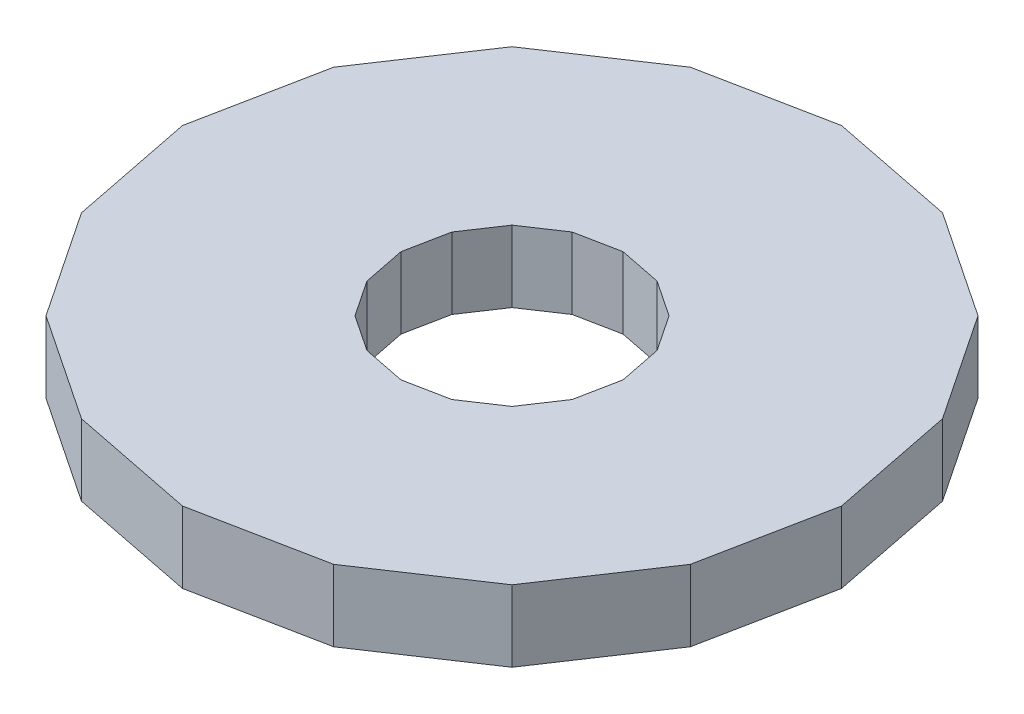
ISO-10303-21;
HEADER;
FILE_DESCRIPTION(('STEP AP214'),'2;1');
FILE_NAME('part.step','',(''),(''),'','','');
FILE_SCHEMA(('AUTOMOTIVE_DESIGN { 1 0 10303 214 1 1 1 1 }'));
ENDSEC;
DATA;
#1=APPLICATION_CONTEXT('core data for automotive mechanical design processes');
#2=APPLICATION_PROTOCOL_DEFINITION('international standard','automotive_design',2000,#1);
#3=PRODUCT_CONTEXT('',#1,'mechanical');
#4=PRODUCT('Part','Part','',(#3));
#5=PRODUCT_RELATED_PRODUCT_CATEGORY('part','',(#4));
#6=PRODUCT_DEFINITION_FORMATION('','',#4);
#7=PRODUCT_DEFINITION_CONTEXT('part definition',#1,'design');
#8=PRODUCT_DEFINITION('design','',#6,#7);
#9=PRODUCT_DEFINITION_SHAPE('','',#8);
#10=(LENGTH_UNIT() NAMED_UNIT(*) SI_UNIT(.MILLI.,.METRE.));
#11=(NAMED_UNIT(*) PLANE_ANGLE_UNIT() SI_UNIT($,.RADIAN.));
#12=(NAMED_UNIT(*) SI_UNIT($,.STERADIAN.) SOLID_ANGLE_UNIT());
#13=UNCERTAINTY_MEASURE_WITH_UNIT(LENGTH_MEASURE(1.E-05),#10,'distance_accuracy_value','');
#14=(GEOMETRIC_REPRESENTATION_CONTEXT(3) GLOBAL_UNCERTAINTY_ASSIGNED_CONTEXT((#13)) GLOBAL_UNIT_ASSIGNED_CONTEXT((#10,
#11,#12)) REPRESENTATION_CONTEXT('',''));
#15=CARTESIAN_POINT('',(0.,0.,0.));
#16=DIRECTION('',(0.,0.,1.));
#17=DIRECTION('',(1.,0.,0.));
#18=AXIS2_PLACEMENT_3D('',#15,#16,#17);
#19=CARTESIAN_POINT('',(0.,19.05,0.));
#20=DIRECTION('',(0.,1.,0.));
#21=DIRECTION('',(0.,0.,1.));
#22=AXIS2_PLACEMENT_3D('',#19,#20,#21);
#23=PLANE('',#22);
#24=DIRECTION('',(0.195090322016118,0.,-0.980785280403233));
#25=VECTOR('',#24,1.);
#26=CARTESIAN_POINT('',(81.1927235611236,19.05,33.6311272650259));
#27=LINE('',#26,#25);
#28=CARTESIAN_POINT('',(81.1927235611236,19.05,33.6311272650259));
#29=VERTEX_POINT('',#28);
#30=CARTESIAN_POINT('',(87.8823707030563,19.05,-9.88793482076298E-13));
#31=VERTEX_POINT('',#30);
#32=EDGE_CURVE('E377',#29,#31,#27,.T.);
#33=ORIENTED_EDGE('',*,*,#32,.T.);
#34=DIRECTION('',(-0.19509032201614,0.,-0.980785280403228));
#35=VECTOR('',#34,1.);
#36=CARTESIAN_POINT('',(87.8823707030563,19.05,-9.88793482076298E-13));
#37=LINE('',#36,#35);
#38=CARTESIAN_POINT('',(81.1927235611229,19.05,-33.6311272650277));
#39=VERTEX_POINT('',#38);
#40=EDGE_CURVE('E381',#31,#39,#37,.T.);
#41=ORIENTED_EDGE('',*,*,#40,.T.);
#42=DIRECTION('',(-0.555570233019611,0.,-0.831469612302539));
#43=VECTOR('',#42,1.);
#44=CARTESIAN_POINT('',(81.1927235611229,19.05,-33.6311272650277));
#45=LINE('',#44,#43);
#46=CARTESIAN_POINT('',(62.1422202708804,19.05,-62.1422202708818));
#47=VERTEX_POINT('',#46);
#48=EDGE_CURVE('E385',#39,#47,#45,.T.);
#49=ORIENTED_EDGE('',*,*,#48,.T.);
#50=DIRECTION('',(-0.831469612302551,0.,-0.555570233019593));
#51=VECTOR('',#50,1.);
#52=CARTESIAN_POINT('',(62.1422202708804,19.05,-62.1422202708818));
#53=LINE('',#52,#51);
#54=CARTESIAN_POINT('',(33.6311272650259,19.05,-81.1927235611237));
#55=VERTEX_POINT('',#54);
#56=EDGE_CURVE('E387',#47,#55,#53,.T.);
#57=ORIENTED_EDGE('',*,*,#56,.T.);
#58=DIRECTION('',(-0.980785280403233,0.,-0.195090322016117));
#59=VECTOR('',#58,1.);
#60=CARTESIAN_POINT('',(33.6311272650259,19.05,-81.1927235611237));
#61=LINE('',#60,#59);
#62=CARTESIAN_POINT('',(-9.85389338037336E-13,19.05,-87.8823707030564));
#63=VERTEX_POINT('',#62);
#64=EDGE_CURVE('E389',#55,#63,#61,.T.);
#65=ORIENTED_EDGE('',*,*,#64,.T.);
#66=DIRECTION('',(-0.980785280403228,0.,0.195090322016139));
#67=VECTOR('',#66,1.);
#68=CARTESIAN_POINT('',(-9.85389338037336E-13,19.05,-87.8823707030564));
#69=LINE('',#68,#67);
#70=CARTESIAN_POINT('',(-33.6311272650277,19.05,-81.1927235611229));
#71=VERTEX_POINT('',#70);
#72=EDGE_CURVE('E391',#63,#71,#69,.T.);
#73=ORIENTED_EDGE('',*,*,#72,.T.);
#74=DIRECTION('',(-0.831469612302539,0.,0.555570233019612));
#75=VECTOR('',#74,1.);
#76=CARTESIAN_POINT('',(-33.6311272650277,19.05,-81.1927235611229));
#77=LINE('',#76,#75);
#78=CARTESIAN_POINT('',(-62.1422202708818,19.05,-62.1422202708804));
#79=VERTEX_POINT('',#78);
#80=EDGE_CURVE('E393',#71,#79,#77,.T.);
#81=ORIENTED_EDGE('',*,*,#80,.T.);
#82=DIRECTION('',(-0.555570233019593,0.,0.831469612302551));
#83=VECTOR('',#82,1.);
#84=CARTESIAN_POINT('',(-62.1422202708818,19.05,-62.1422202708804));
#85=LINE('',#84,#83);
#86=CARTESIAN_POINT('',(-81.1927235611237,19.05,-33.6311272650259));
#87=VERTEX_POINT('',#86);
#88=EDGE_CURVE('E395',#79,#87,#85,.T.);
#89=ORIENTED_EDGE('',*,*,#88,.T.);
#90=DIRECTION('',(-0.195090322016117,0.,0.980785280403233));
#91=VECTOR('',#90,1.);
#92=CARTESIAN_POINT('',(-81.1927235611237,19.05,-33.6311272650259));
#93=LINE('',#92,#91);
#94=CARTESIAN_POINT('',(-87.8823707030563,19.05,9.43670599142186E-13));
#95=VERTEX_POINT('',#94);
#96=EDGE_CURVE('E397',#87,#95,#93,.T.);
#97=ORIENTED_EDGE('',*,*,#96,.T.);
#98=DIRECTION('',(0.195090322016139,0.,0.980785280403228));
#99=VECTOR('',#98,1.);
#100=CARTESIAN_POINT('',(-87.8823707030563,19.05,9.43670599142186E-13));
#101=LINE('',#100,#99);
#102=CARTESIAN_POINT('',(-81.1927235611229,19.05,33.6311272650277));
#103=VERTEX_POINT('',#102);
#104=EDGE_CURVE('E399',#95,#103,#101,.T.);
#105=ORIENTED_EDGE('',*,*,#104,.T.);
#106=DIRECTION('',(0.555570233019611,0.,0.831469612302539));
#107=VECTOR('',#106,1.);
#108=CARTESIAN_POINT('',(-81.1927235611229,19.05,33.6311272650277));
#109=LINE('',#108,#107);
#110=CARTESIAN_POINT('',(-62.1422202708804,19.05,62.1422202708818));
#111=VERTEX_POINT('',#110);
#112=EDGE_CURVE('E401',#103,#111,#109,.T.);
#113=ORIENTED_EDGE('',*,*,#112,.T.);
#114=DIRECTION('',(0.831469612302552,0.,0.555570233019593));
#115=VECTOR('',#114,1.);
#116=CARTESIAN_POINT('',(-62.1422202708804,19.05,62.1422202708818));
#117=LINE('',#116,#115);
#118=CARTESIAN_POINT('',(-33.6311272650259,19.05,81.1927235611237));
#119=VERTEX_POINT('',#118);
#120=EDGE_CURVE('E403',#111,#119,#117,.T.);
#121=ORIENTED_EDGE('',*,*,#120,.T.);
#122=DIRECTION('',(0.980785280403233,0.,0.195090322016118));
#123=VECTOR('',#122,1.);
#124=CARTESIAN_POINT('',(-33.6311272650259,19.05,81.1927235611237));
#125=LINE('',#124,#123);
#126=CARTESIAN_POINT('',(9.94113703043829E-13,19.05,87.8823707030563));
#127=VERTEX_POINT('',#126);
#128=EDGE_CURVE('E405',#119,#127,#125,.T.);
#129=ORIENTED_EDGE('',*,*,#128,.T.);
#130=DIRECTION('',(0.980785280403228,0.,-0.195090322016139));
#131=VECTOR('',#130,1.);
#132=CARTESIAN_POINT('',(9.94113703043829E-13,19.05,87.8823707030563));
#133=LINE('',#132,#131);
#134=CARTESIAN_POINT('',(33.6311272650277,19.05,81.1927235611229));
#135=VERTEX_POINT('',#134);
#136=EDGE_CURVE('E407',#127,#135,#133,.T.);
#137=ORIENTED_EDGE('',*,*,#136,.T.);
#138=DIRECTION('',(0.831469612302539,0.,-0.555570233019612));
#139=VECTOR('',#138,1.);
#140=CARTESIAN_POINT('',(33.6311272650277,19.05,81.1927235611229));
#141=LINE('',#140,#139);
#142=CARTESIAN_POINT('',(62.1422202708818,19.05,62.1422202708804));
#143=VERTEX_POINT('',#142);
#144=EDGE_CURVE('E409',#135,#143,#141,.T.);
#145=ORIENTED_EDGE('',*,*,#144,.T.);
#146=DIRECTION('',(0.555570233019593,0.,-0.831469612302551));
#147=VECTOR('',#146,1.);
#148=CARTESIAN_POINT('',(62.1422202708818,19.05,62.1422202708804));
#149=LINE('',#148,#147);
#150=EDGE_CURVE('E411',#143,#29,#149,.T.);
#151=ORIENTED_EDGE('',*,*,#150,.T.);
#152=EDGE_LOOP('',(#33,#41,#49,#57,#65,#73,#81,#89,#97,#105,#113,#121,#129,#137,#145,#151));
#153=FACE_BOUND('',#152,.T.);
#154=DIRECTION('',(-0.195090322016139,0.,-0.980785280403228));
#155=VECTOR('',#154,1.);
#156=CARTESIAN_POINT('',(29.6127360114509,19.05,-3.31302602909172E-13));
#157=LINE('',#156,#155);
#158=CARTESIAN_POINT('',(29.6127360114509,19.05,-3.31302602909172E-13));
#159=VERTEX_POINT('',#158);
#160=CARTESIAN_POINT('',(27.3586007026393,19.05,-11.3323034585836));
#161=VERTEX_POINT('',#160);
#162=EDGE_CURVE('E253',#159,#161,#157,.T.);
#163=ORIENTED_EDGE('',*,*,#162,.F.);
#164=DIRECTION('',(0.195090322016117,0.,-0.980785280403233));
#165=VECTOR('',#164,1.);
#166=CARTESIAN_POINT('',(27.3586007026396,19.05,11.332303458583));
#167=LINE('',#166,#165);
#168=CARTESIAN_POINT('',(27.3586007026396,19.05,11.332303458583));
#169=VERTEX_POINT('',#168);
#170=EDGE_CURVE('E244',#169,#159,#167,.T.);
#171=ORIENTED_EDGE('',*,*,#170,.F.);
#172=DIRECTION('',(0.555570233019593,0.,-0.831469612302551));
#173=VECTOR('',#172,1.);
#174=CARTESIAN_POINT('',(20.9393664431843,19.05,20.9393664431838));
#175=LINE('',#174,#173);
#176=CARTESIAN_POINT('',(20.9393664431843,19.05,20.9393664431838));
#177=VERTEX_POINT('',#176);
#178=EDGE_CURVE('E299',#177,#169,#175,.T.);
#179=ORIENTED_EDGE('',*,*,#178,.F.);
#180=DIRECTION('',(0.831469612302539,0.,-0.555570233019612));
#181=VECTOR('',#180,1.);
#182=CARTESIAN_POINT('',(11.3323034585837,19.05,27.3586007026393));
#183=LINE('',#182,#181);
#184=CARTESIAN_POINT('',(11.3323034585837,19.05,27.3586007026393));
#185=VERTEX_POINT('',#184);
#186=EDGE_CURVE('E296',#185,#177,#183,.T.);
#187=ORIENTED_EDGE('',*,*,#186,.F.);
#188=DIRECTION('',(0.980785280403228,0.,-0.19509032201614));
#189=VECTOR('',#188,1.);
#190=CARTESIAN_POINT('',(3.33597215897801E-13,19.05,29.6127360114509));
#191=LINE('',#190,#189);
#192=CARTESIAN_POINT('',(3.33597215897801E-13,19.05,29.6127360114509));
#193=VERTEX_POINT('',#192);
#194=EDGE_CURVE('E293',#193,#185,#191,.T.);
#195=ORIENTED_EDGE('',*,*,#194,.F.);
#196=DIRECTION('',(0.980785280403233,0.,0.195090322016117));
#197=VECTOR('',#196,1.);
#198=CARTESIAN_POINT('',(-11.332303458583,19.05,27.3586007026396));
#199=LINE('',#198,#197);
#200=CARTESIAN_POINT('',(-11.332303458583,19.05,27.3586007026396));
#201=VERTEX_POINT('',#200);
#202=EDGE_CURVE('E291',#201,#193,#199,.T.);
#203=ORIENTED_EDGE('',*,*,#202,.F.);
#204=DIRECTION('',(0.831469612302552,0.,0.555570233019593));
#205=VECTOR('',#204,1.);
#206=CARTESIAN_POINT('',(-20.9393664431838,19.05,20.9393664431843));
#207=LINE('',#206,#205);
#208=CARTESIAN_POINT('',(-20.9393664431838,19.05,20.9393664431843));
#209=VERTEX_POINT('',#208);
#210=EDGE_CURVE('E288',#209,#201,#207,.T.);
#211=ORIENTED_EDGE('',*,*,#210,.F.);
#212=DIRECTION('',(0.555570233019612,0.,0.831469612302539));
#213=VECTOR('',#212,1.);
#214=CARTESIAN_POINT('',(-27.3586007026393,19.05,11.3323034585836));
#215=LINE('',#214,#213);
#216=CARTESIAN_POINT('',(-27.3586007026393,19.05,11.3323034585836));
#217=VERTEX_POINT('',#216);
#218=EDGE_CURVE('E286',#217,#209,#215,.T.);
#219=ORIENTED_EDGE('',*,*,#218,.F.);
#220=DIRECTION('',(0.195090322016139,0.,0.980785280403228));
#221=VECTOR('',#220,1.);
#222=CARTESIAN_POINT('',(-29.6127360114509,19.05,3.48672670994903E-13));
#223=LINE('',#222,#221);
#224=CARTESIAN_POINT('',(-29.6127360114509,19.05,3.48672670994903E-13));
#225=VERTEX_POINT('',#224);
#226=EDGE_CURVE('E283',#225,#217,#223,.T.);
#227=ORIENTED_EDGE('',*,*,#226,.F.);
#228=DIRECTION('',(-0.195090322016117,0.,0.980785280403233));
#229=VECTOR('',#228,1.);
#230=CARTESIAN_POINT('',(-27.3586007026396,19.05,-11.332303458583));
#231=LINE('',#230,#229);
#232=CARTESIAN_POINT('',(-27.3586007026396,19.05,-11.332303458583));
#233=VERTEX_POINT('',#232);
#234=EDGE_CURVE('E281',#233,#225,#231,.T.);
#235=ORIENTED_EDGE('',*,*,#234,.F.);
#236=DIRECTION('',(-0.555570233019593,0.,0.831469612302551));
#237=VECTOR('',#236,1.);
#238=CARTESIAN_POINT('',(-20.9393664431843,19.05,-20.9393664431838));
#239=LINE('',#238,#237);
#240=CARTESIAN_POINT('',(-20.9393664431843,19.05,-20.9393664431838));
#241=VERTEX_POINT('',#240);
#242=EDGE_CURVE('E279',#241,#233,#239,.T.);
#243=ORIENTED_EDGE('',*,*,#242,.F.);
#244=DIRECTION('',(-0.831469612302539,0.,0.555570233019612));
#245=VECTOR('',#244,1.);
#246=CARTESIAN_POINT('',(-11.3323034585836,19.05,-27.3586007026393));
#247=LINE('',#246,#245);
#248=CARTESIAN_POINT('',(-11.3323034585836,19.05,-27.3586007026393));
#249=VERTEX_POINT('',#248);
#250=EDGE_CURVE('E277',#249,#241,#247,.T.);
#251=ORIENTED_EDGE('',*,*,#250,.F.);
#252=DIRECTION('',(-0.980785280403228,0.,0.195090322016139));
#253=VECTOR('',#252,1.);
#254=CARTESIAN_POINT('',(-3.57441096400448E-13,19.05,-29.6127360114509));
#255=LINE('',#254,#253);
#256=CARTESIAN_POINT('',(-3.57441096400448E-13,19.05,-29.6127360114509));
#257=VERTEX_POINT('',#256);
#258=EDGE_CURVE('E275',#257,#249,#255,.T.);
#259=ORIENTED_EDGE('',*,*,#258,.F.);
#260=DIRECTION('',(-0.980785280403233,0.,-0.195090322016117));
#261=VECTOR('',#260,1.);
#262=CARTESIAN_POINT('',(11.332303458583,19.05,-27.3586007026396));
#263=LINE('',#262,#261);
#264=CARTESIAN_POINT('',(11.332303458583,19.05,-27.3586007026396));
#265=VERTEX_POINT('',#264);
#266=EDGE_CURVE('E273',#265,#257,#263,.T.);
#267=ORIENTED_EDGE('',*,*,#266,.F.);
#268=DIRECTION('',(-0.831469612302552,0.,-0.555570233019593));
#269=VECTOR('',#268,1.);
#270=CARTESIAN_POINT('',(20.9393664431838,19.05,-20.9393664431843));
#271=LINE('',#270,#269);
#272=CARTESIAN_POINT('',(20.9393664431838,19.05,-20.9393664431843));
#273=VERTEX_POINT('',#272);
#274=EDGE_CURVE('E269',#273,#265,#271,.T.);
#275=ORIENTED_EDGE('',*,*,#274,.F.);
#276=DIRECTION('',(-0.555570233019612,0.,-0.831469612302539));
#277=VECTOR('',#276,1.);
#278=CARTESIAN_POINT('',(27.3586007026393,19.05,-11.3323034585836));
#279=LINE('',#278,#277);
#280=EDGE_CURVE('E267',#161,#273,#279,.T.);
#281=ORIENTED_EDGE('',*,*,#280,.F.);
#282=EDGE_LOOP('',(#163,#171,#179,#187,#195,#203,#211,#219,#227,#235,#243,#251,#259,#267,#275,#281));
#283=FACE_BOUND('',#282,.T.);
#284=ADVANCED_FACE('F35',(#153,#283),#23,.T.);
#285=CARTESIAN_POINT('',(0.,0.,0.));
#286=DIRECTION('',(0.,1.,0.));
#287=DIRECTION('',(0.,0.,1.));
#288=AXIS2_PLACEMENT_3D('',#285,#286,#287);
#289=PLANE('',#288);
#290=DIRECTION('',(0.195090322016118,0.,-0.980785280403233));
#291=VECTOR('',#290,1.);
#292=CARTESIAN_POINT('',(81.1927235611236,0.,33.6311272650259));
#293=LINE('',#292,#291);
#294=CARTESIAN_POINT('',(81.1927235611236,0.,33.6311272650259));
#295=VERTEX_POINT('',#294);
#296=CARTESIAN_POINT('',(87.8823707030563,0.,-9.88793482076298E-13));
#297=VERTEX_POINT('',#296);
#298=EDGE_CURVE('E262',#295,#297,#293,.T.);
#299=ORIENTED_EDGE('',*,*,#298,.F.);
#300=DIRECTION('',(0.555570233019593,0.,-0.831469612302551));
#301=VECTOR('',#300,1.);
#302=CARTESIAN_POINT('',(62.1422202708818,0.,62.1422202708804));
#303=LINE('',#302,#301);
#304=CARTESIAN_POINT('',(62.1422202708818,0.,62.1422202708804));
#305=VERTEX_POINT('',#304);
#306=EDGE_CURVE('E382',#305,#295,#303,.T.);
#307=ORIENTED_EDGE('',*,*,#306,.F.);
#308=DIRECTION('',(0.831469612302539,0.,-0.555570233019612));
#309=VECTOR('',#308,1.);
#310=CARTESIAN_POINT('',(33.6311272650277,0.,81.1927235611229));
#311=LINE('',#310,#309);
#312=CARTESIAN_POINT('',(33.6311272650277,0.,81.1927235611229));
#313=VERTEX_POINT('',#312);
#314=EDGE_CURVE('E443',#313,#305,#311,.T.);
#315=ORIENTED_EDGE('',*,*,#314,.F.);
#316=DIRECTION('',(0.980785280403228,0.,-0.195090322016139));
#317=VECTOR('',#316,1.);
#318=CARTESIAN_POINT('',(9.94113703043829E-13,0.,87.8823707030563));
#319=LINE('',#318,#317);
#320=CARTESIAN_POINT('',(9.94113703043829E-13,0.,87.8823707030563));
#321=VERTEX_POINT('',#320);
#322=EDGE_CURVE('E441',#321,#313,#319,.T.);
#323=ORIENTED_EDGE('',*,*,#322,.F.);
#324=DIRECTION('',(0.980785280403233,0.,0.195090322016118));
#325=VECTOR('',#324,1.);
#326=CARTESIAN_POINT('',(-33.6311272650259,0.,81.1927235611237));
#327=LINE('',#326,#325);
#328=CARTESIAN_POINT('',(-33.6311272650259,0.,81.1927235611237));
#329=VERTEX_POINT('',#328);
#330=EDGE_CURVE('E439',#329,#321,#327,.T.);
#331=ORIENTED_EDGE('',*,*,#330,.F.);
#332=DIRECTION('',(0.831469612302552,0.,0.555570233019593));
#333=VECTOR('',#332,1.);
#334=CARTESIAN_POINT('',(-62.1422202708804,0.,62.1422202708818));
#335=LINE('',#334,#333);
#336=CARTESIAN_POINT('',(-62.1422202708804,0.,62.1422202708818));
#337=VERTEX_POINT('',#336);
#338=EDGE_CURVE('E437',#337,#329,#335,.T.);
#339=ORIENTED_EDGE('',*,*,#338,.F.);
#340=DIRECTION('',(0.555570233019611,0.,0.831469612302539));
#341=VECTOR('',#340,1.);
#342=CARTESIAN_POINT('',(-81.1927235611229,0.,33.6311272650277));
#343=LINE('',#342,#341);
#344=CARTESIAN_POINT('',(-81.1927235611229,0.,33.6311272650277));
#345=VERTEX_POINT('',#344);
#346=EDGE_CURVE('E435',#345,#337,#343,.T.);
#347=ORIENTED_EDGE('',*,*,#346,.F.);
#348=DIRECTION('',(0.195090322016139,0.,0.980785280403228));
#349=VECTOR('',#348,1.);
#350=CARTESIAN_POINT('',(-87.8823707030563,0.,9.43670599142186E-13));
#351=LINE('',#350,#349);
#352=CARTESIAN_POINT('',(-87.8823707030563,0.,9.43670599142186E-13));
#353=VERTEX_POINT('',#352);
#354=EDGE_CURVE('E433',#353,#345,#351,.T.);
#355=ORIENTED_EDGE('',*,*,#354,.F.);
#356=DIRECTION('',(-0.195090322016117,0.,0.980785280403233));
#357=VECTOR('',#356,1.);
#358=CARTESIAN_POINT('',(-81.1927235611237,0.,-33.6311272650259));
#359=LINE('',#358,#357);
#360=CARTESIAN_POINT('',(-81.1927235611237,0.,-33.6311272650259));
#361=VERTEX_POINT('',#360);
#362=EDGE_CURVE('E431',#361,#353,#359,.T.);
#363=ORIENTED_EDGE('',*,*,#362,.F.);
#364=DIRECTION('',(-0.555570233019593,0.,0.831469612302551));
#365=VECTOR('',#364,1.);
#366=CARTESIAN_POINT('',(-62.1422202708818,0.,-62.1422202708804));
#367=LINE('',#366,#365);
#368=CARTESIAN_POINT('',(-62.1422202708818,0.,-62.1422202708804));
#369=VERTEX_POINT('',#368);
#370=EDGE_CURVE('E429',#369,#361,#367,.T.);
#371=ORIENTED_EDGE('',*,*,#370,.F.);
#372=DIRECTION('',(-0.831469612302539,0.,0.555570233019612));
#373=VECTOR('',#372,1.);
#374=CARTESIAN_POINT('',(-33.6311272650277,0.,-81.1927235611229));
#375=LINE('',#374,#373);
#376=CARTESIAN_POINT('',(-33.6311272650277,0.,-81.1927235611229));
#377=VERTEX_POINT('',#376);
#378=EDGE_CURVE('E427',#377,#369,#375,.T.);
#379=ORIENTED_EDGE('',*,*,#378,.F.);
#380=DIRECTION('',(-0.980785280403228,0.,0.195090322016139));
#381=VECTOR('',#380,1.);
#382=CARTESIAN_POINT('',(-9.85389338037336E-13,0.,-87.8823707030564));
#383=LINE('',#382,#381);
#384=CARTESIAN_POINT('',(-9.85389338037336E-13,0.,-87.8823707030564));
#385=VERTEX_POINT('',#384);
#386=EDGE_CURVE('E425',#385,#377,#383,.T.);
#387=ORIENTED_EDGE('',*,*,#386,.F.);
#388=DIRECTION('',(-0.980785280403233,0.,-0.195090322016117));
#389=VECTOR('',#388,1.);
#390=CARTESIAN_POINT('',(33.6311272650259,0.,-81.1927235611237));
#391=LINE('',#390,#389);
#392=CARTESIAN_POINT('',(33.6311272650259,0.,-81.1927235611237));
#393=VERTEX_POINT('',#392);
#394=EDGE_CURVE('E423',#393,#385,#391,.T.);
#395=ORIENTED_EDGE('',*,*,#394,.F.);
#396=DIRECTION('',(-0.831469612302551,0.,-0.555570233019593));
#397=VECTOR('',#396,1.);
#398=CARTESIAN_POINT('',(62.1422202708804,0.,-62.1422202708818));
#399=LINE('',#398,#397);
#400=CARTESIAN_POINT('',(62.1422202708804,0.,-62.1422202708818));
#401=VERTEX_POINT('',#400);
#402=EDGE_CURVE('E421',#401,#393,#399,.T.);
#403=ORIENTED_EDGE('',*,*,#402,.F.);
#404=DIRECTION('',(-0.555570233019611,0.,-0.831469612302539));
#405=VECTOR('',#404,1.);
#406=CARTESIAN_POINT('',(81.1927235611229,0.,-33.6311272650277));
#407=LINE('',#406,#405);
#408=CARTESIAN_POINT('',(81.1927235611229,0.,-33.6311272650277));
#409=VERTEX_POINT('',#408);
#410=EDGE_CURVE('E419',#409,#401,#407,.T.);
#411=ORIENTED_EDGE('',*,*,#410,.F.);
#412=DIRECTION('',(-0.19509032201614,0.,-0.980785280403228));
#413=VECTOR('',#412,1.);
#414=CARTESIAN_POINT('',(87.8823707030563,0.,-9.88793482076298E-13));
#415=LINE('',#414,#413);
#416=EDGE_CURVE('E416',#297,#409,#415,.T.);
#417=ORIENTED_EDGE('',*,*,#416,.F.);
#418=EDGE_LOOP('',(#299,#307,#315,#323,#331,#339,#347,#355,#363,#371,#379,#387,#395,#403,#411,#417));
#419=FACE_BOUND('',#418,.T.);
#420=DIRECTION('',(0.195090322016117,0.,-0.980785280403233));
#421=VECTOR('',#420,1.);
#422=CARTESIAN_POINT('',(27.3586007026396,0.,11.332303458583));
#423=LINE('',#422,#421);
#424=CARTESIAN_POINT('',(27.3586007026396,0.,11.332303458583));
#425=VERTEX_POINT('',#424);
#426=CARTESIAN_POINT('',(29.6127360114509,0.,-3.31302602909172E-13));
#427=VERTEX_POINT('',#426);
#428=EDGE_CURVE('E58',#425,#427,#423,.T.);
#429=ORIENTED_EDGE('',*,*,#428,.T.);
#430=DIRECTION('',(-0.195090322016139,0.,-0.980785280403228));
#431=VECTOR('',#430,1.);
#432=CARTESIAN_POINT('',(29.6127360114509,0.,-3.31302602909172E-13));
#433=LINE('',#432,#431);
#434=CARTESIAN_POINT('',(27.3586007026393,0.,-11.3323034585836));
#435=VERTEX_POINT('',#434);
#436=EDGE_CURVE('E260',#427,#435,#433,.T.);
#437=ORIENTED_EDGE('',*,*,#436,.T.);
#438=DIRECTION('',(-0.555570233019612,0.,-0.831469612302539));
#439=VECTOR('',#438,1.);
#440=CARTESIAN_POINT('',(27.3586007026393,0.,-11.3323034585836));
#441=LINE('',#440,#439);
#442=CARTESIAN_POINT('',(20.9393664431838,0.,-20.9393664431843));
#443=VERTEX_POINT('',#442);
#444=EDGE_CURVE('E304',#435,#443,#441,.T.);
#445=ORIENTED_EDGE('',*,*,#444,.T.);
#446=DIRECTION('',(-0.831469612302552,0.,-0.555570233019593));
#447=VECTOR('',#446,1.);
#448=CARTESIAN_POINT('',(20.9393664431838,0.,-20.9393664431843));
#449=LINE('',#448,#447);
#450=CARTESIAN_POINT('',(11.332303458583,0.,-27.3586007026396));
#451=VERTEX_POINT('',#450);
#452=EDGE_CURVE('E308',#443,#451,#449,.T.);
#453=ORIENTED_EDGE('',*,*,#452,.T.);
#454=DIRECTION('',(-0.980785280403233,0.,-0.195090322016117));
#455=VECTOR('',#454,1.);
#456=CARTESIAN_POINT('',(11.332303458583,0.,-27.3586007026396));
#457=LINE('',#456,#455);
#458=CARTESIAN_POINT('',(-3.57441096400448E-13,0.,-29.6127360114509));
#459=VERTEX_POINT('',#458);
#460=EDGE_CURVE('E311',#451,#459,#457,.T.);
#461=ORIENTED_EDGE('',*,*,#460,.T.);
#462=DIRECTION('',(-0.980785280403228,0.,0.195090322016139));
#463=VECTOR('',#462,1.);
#464=CARTESIAN_POINT('',(-3.57441096400448E-13,0.,-29.6127360114509));
#465=LINE('',#464,#463);
#466=CARTESIAN_POINT('',(-11.3323034585836,0.,-27.3586007026393));
#467=VERTEX_POINT('',#466);
#468=EDGE_CURVE('E314',#459,#467,#465,.T.);
#469=ORIENTED_EDGE('',*,*,#468,.T.);
#470=DIRECTION('',(-0.831469612302539,0.,0.555570233019612));
#471=VECTOR('',#470,1.);
#472=CARTESIAN_POINT('',(-11.3323034585836,0.,-27.3586007026393));
#473=LINE('',#472,#471);
#474=CARTESIAN_POINT('',(-20.9393664431843,0.,-20.9393664431838));
#475=VERTEX_POINT('',#474);
#476=EDGE_CURVE('E317',#467,#475,#473,.T.);
#477=ORIENTED_EDGE('',*,*,#476,.T.);
#478=DIRECTION('',(-0.555570233019593,0.,0.831469612302551));
#479=VECTOR('',#478,1.);
#480=CARTESIAN_POINT('',(-20.9393664431843,0.,-20.9393664431838));
#481=LINE('',#480,#479);
#482=CARTESIAN_POINT('',(-27.3586007026396,0.,-11.332303458583));
#483=VERTEX_POINT('',#482);
#484=EDGE_CURVE('E320',#475,#483,#481,.T.);
#485=ORIENTED_EDGE('',*,*,#484,.T.);
#486=DIRECTION('',(-0.195090322016117,0.,0.980785280403233));
#487=VECTOR('',#486,1.);
#488=CARTESIAN_POINT('',(-27.3586007026396,0.,-11.332303458583));
#489=LINE('',#488,#487);
#490=CARTESIAN_POINT('',(-29.6127360114509,0.,3.48672670994903E-13));
#491=VERTEX_POINT('',#490);
#492=EDGE_CURVE('E323',#483,#491,#489,.T.);
#493=ORIENTED_EDGE('',*,*,#492,.T.);
#494=DIRECTION('',(0.195090322016139,0.,0.980785280403228));
#495=VECTOR('',#494,1.);
#496=CARTESIAN_POINT('',(-29.6127360114509,0.,3.48672670994903E-13));
#497=LINE('',#496,#495);
#498=CARTESIAN_POINT('',(-27.3586007026393,0.,11.3323034585836));
#499=VERTEX_POINT('',#498);
#500=EDGE_CURVE('E327',#491,#499,#497,.T.);
#501=ORIENTED_EDGE('',*,*,#500,.T.);
#502=DIRECTION('',(0.555570233019612,0.,0.831469612302539));
#503=VECTOR('',#502,1.);
#504=CARTESIAN_POINT('',(-27.3586007026393,0.,11.3323034585836));
#505=LINE('',#504,#503);
#506=CARTESIAN_POINT('',(-20.9393664431838,0.,20.9393664431843));
#507=VERTEX_POINT('',#506);
#508=EDGE_CURVE('E330',#499,#507,#505,.T.);
#509=ORIENTED_EDGE('',*,*,#508,.T.);
#510=DIRECTION('',(0.831469612302552,0.,0.555570233019593));
#511=VECTOR('',#510,1.);
#512=CARTESIAN_POINT('',(-20.9393664431838,0.,20.9393664431843));
#513=LINE('',#512,#511);
#514=CARTESIAN_POINT('',(-11.332303458583,0.,27.3586007026396));
#515=VERTEX_POINT('',#514);
#516=EDGE_CURVE('E333',#507,#515,#513,.T.);
#517=ORIENTED_EDGE('',*,*,#516,.T.);
#518=DIRECTION('',(0.980785280403233,0.,0.195090322016117));
#519=VECTOR('',#518,1.);
#520=CARTESIAN_POINT('',(-11.332303458583,0.,27.3586007026396));
#521=LINE('',#520,#519);
#522=CARTESIAN_POINT('',(3.33597215897801E-13,0.,29.6127360114509));
#523=VERTEX_POINT('',#522);
#524=EDGE_CURVE('E336',#515,#523,#521,.T.);
#525=ORIENTED_EDGE('',*,*,#524,.T.);
#526=DIRECTION('',(0.980785280403228,0.,-0.19509032201614));
#527=VECTOR('',#526,1.);
#528=CARTESIAN_POINT('',(3.33597215897801E-13,0.,29.6127360114509));
#529=LINE('',#528,#527);
#530=CARTESIAN_POINT('',(11.3323034585837,0.,27.3586007026393));
#531=VERTEX_POINT('',#530);
#532=EDGE_CURVE('E339',#523,#531,#529,.T.);
#533=ORIENTED_EDGE('',*,*,#532,.T.);
#534=DIRECTION('',(0.831469612302539,0.,-0.555570233019612));
#535=VECTOR('',#534,1.);
#536=CARTESIAN_POINT('',(11.3323034585837,0.,27.3586007026393));
#537=LINE('',#536,#535);
#538=CARTESIAN_POINT('',(20.9393664431843,0.,20.9393664431838));
#539=VERTEX_POINT('',#538);
#540=EDGE_CURVE('E342',#531,#539,#537,.T.);
#541=ORIENTED_EDGE('',*,*,#540,.T.);
#542=DIRECTION('',(0.555570233019593,0.,-0.831469612302551));
#543=VECTOR('',#542,1.);
#544=CARTESIAN_POINT('',(20.9393664431843,0.,20.9393664431838));
#545=LINE('',#544,#543);
#546=EDGE_CURVE('E254',#539,#425,#545,.T.);
#547=ORIENTED_EDGE('',*,*,#546,.T.);
#548=EDGE_LOOP('',(#429,#437,#445,#453,#461,#469,#477,#485,#493,#501,#509,#517,#525,#533,#541,#547));
#549=FACE_BOUND('',#548,.T.);
#550=ADVANCED_FACE('F498',(#419,#549),#289,.F.);
#551=CARTESIAN_POINT('',(81.1927235611236,19.05,33.6311272650259));
#552=DIRECTION('',(-0.980785280403233,0.,-0.195090322016118));
#553=DIRECTION('',(-0.195090322016118,0.,0.980785280403233));
#554=AXIS2_PLACEMENT_3D('',#551,#552,#553);
#555=PLANE('',#554);
#556=ORIENTED_EDGE('',*,*,#298,.T.);
#557=DIRECTION('',(0.,-1.,0.));
#558=VECTOR('',#557,1.);
#559=CARTESIAN_POINT('',(87.8823707030563,19.05,-9.88793482076298E-13));
#560=LINE('',#559,#558);
#561=EDGE_CURVE('E11',#31,#297,#560,.T.);
#562=ORIENTED_EDGE('',*,*,#561,.F.);
#563=ORIENTED_EDGE('',*,*,#32,.F.);
#564=DIRECTION('',(0.,-1.,0.));
#565=VECTOR('',#564,1.);
#566=CARTESIAN_POINT('',(81.1927235611236,19.05,33.6311272650259));
#567=LINE('',#566,#565);
#568=EDGE_CURVE('E413',#29,#295,#567,.T.);
#569=ORIENTED_EDGE('',*,*,#568,.T.);
#570=EDGE_LOOP('',(#556,#562,#563,#569));
#571=FACE_BOUND('',#570,.T.);
#572=ADVANCED_FACE('F37',(#571),#555,.F.);
#573=CARTESIAN_POINT('',(87.8823707030563,19.05,-9.88793482076298E-13));
#574=DIRECTION('',(-0.980785280403228,0.,0.19509032201614));
#575=DIRECTION('',(0.19509032201614,0.,0.980785280403228));
#576=AXIS2_PLACEMENT_3D('',#573,#574,#575);
#577=PLANE('',#576);
#578=ORIENTED_EDGE('',*,*,#416,.T.);
#579=DIRECTION('',(0.,-1.,0.));
#580=VECTOR('',#579,1.);
#581=CARTESIAN_POINT('',(81.1927235611229,19.05,-33.6311272650277));
#582=LINE('',#581,#580);
#583=EDGE_CURVE('E43',#39,#409,#582,.T.);
#584=ORIENTED_EDGE('',*,*,#583,.F.);
#585=ORIENTED_EDGE('',*,*,#40,.F.);
#586=ORIENTED_EDGE('',*,*,#561,.T.);
#587=EDGE_LOOP('',(#578,#584,#585,#586));
#588=FACE_BOUND('',#587,.T.);
#589=ADVANCED_FACE('F515',(#588),#577,.F.);
#590=CARTESIAN_POINT('',(81.1927235611229,19.05,-33.6311272650277));
#591=DIRECTION('',(-0.831469612302539,0.,0.555570233019611));
#592=DIRECTION('',(0.555570233019611,0.,0.831469612302539));
#593=AXIS2_PLACEMENT_3D('',#590,#591,#592);
#594=PLANE('',#593);
#595=ORIENTED_EDGE('',*,*,#410,.T.);
#596=DIRECTION('',(0.,-1.,0.));
#597=VECTOR('',#596,1.);
#598=CARTESIAN_POINT('',(62.1422202708804,19.05,-62.1422202708818));
#599=LINE('',#598,#597);
#600=EDGE_CURVE('E485',#47,#401,#599,.T.);
#601=ORIENTED_EDGE('',*,*,#600,.F.);
#602=ORIENTED_EDGE('',*,*,#48,.F.);
#603=ORIENTED_EDGE('',*,*,#583,.T.);
#604=EDGE_LOOP('',(#595,#601,#602,#603));
#605=FACE_BOUND('',#604,.T.);
#606=ADVANCED_FACE('F492',(#605),#594,.F.);
#607=CARTESIAN_POINT('',(62.1422202708804,19.05,-62.1422202708818));
#608=DIRECTION('',(-0.555570233019593,0.,0.831469612302551));
#609=DIRECTION('',(0.831469612302551,0.,0.555570233019593));
#610=AXIS2_PLACEMENT_3D('',#607,#608,#609);
#611=PLANE('',#610);
#612=ORIENTED_EDGE('',*,*,#402,.T.);
#613=DIRECTION('',(0.,-1.,0.));
#614=VECTOR('',#613,1.);
#615=CARTESIAN_POINT('',(33.6311272650259,19.05,-81.1927235611237));
#616=LINE('',#615,#614);
#617=EDGE_CURVE('E482',#55,#393,#616,.T.);
#618=ORIENTED_EDGE('',*,*,#617,.F.);
#619=ORIENTED_EDGE('',*,*,#56,.F.);
#620=ORIENTED_EDGE('',*,*,#600,.T.);
#621=EDGE_LOOP('',(#612,#618,#619,#620));
#622=FACE_BOUND('',#621,.T.);
#623=ADVANCED_FACE('F504',(#622),#611,.F.);
#624=CARTESIAN_POINT('',(33.6311272650259,19.05,-81.1927235611237));
#625=DIRECTION('',(-0.195090322016117,0.,0.980785280403233));
#626=DIRECTION('',(0.980785280403233,0.,0.195090322016117));
#627=AXIS2_PLACEMENT_3D('',#624,#625,#626);
#628=PLANE('',#627);
#629=ORIENTED_EDGE('',*,*,#394,.T.);
#630=DIRECTION('',(0.,-1.,0.));
#631=VECTOR('',#630,1.);
#632=CARTESIAN_POINT('',(-9.85389338037336E-13,19.05,-87.8823707030564));
#633=LINE('',#632,#631);
#634=EDGE_CURVE('E479',#63,#385,#633,.T.);
#635=ORIENTED_EDGE('',*,*,#634,.F.);
#636=ORIENTED_EDGE('',*,*,#64,.F.);
#637=ORIENTED_EDGE('',*,*,#617,.T.);
#638=EDGE_LOOP('',(#629,#635,#636,#637));
#639=FACE_BOUND('',#638,.T.);
#640=ADVANCED_FACE('F508',(#639),#628,.F.);
#641=CARTESIAN_POINT('',(-9.85389338037336E-13,19.05,-87.8823707030564));
#642=DIRECTION('',(0.195090322016139,0.,0.980785280403228));
#643=DIRECTION('',(0.980785280403228,0.,-0.195090322016139));
#644=AXIS2_PLACEMENT_3D('',#641,#642,#643);
#645=PLANE('',#644);
#646=ORIENTED_EDGE('',*,*,#386,.T.);
#647=DIRECTION('',(0.,-1.,0.));
#648=VECTOR('',#647,1.);
#649=CARTESIAN_POINT('',(-33.6311272650277,19.05,-81.1927235611229));
#650=LINE('',#649,#648);
#651=EDGE_CURVE('E476',#71,#377,#650,.T.);
#652=ORIENTED_EDGE('',*,*,#651,.F.);
#653=ORIENTED_EDGE('',*,*,#72,.F.);
#654=ORIENTED_EDGE('',*,*,#634,.T.);
#655=EDGE_LOOP('',(#646,#652,#653,#654));
#656=FACE_BOUND('',#655,.T.);
#657=ADVANCED_FACE('F568',(#656),#645,.F.);
#658=CARTESIAN_POINT('',(-33.6311272650277,19.05,-81.1927235611229));
#659=DIRECTION('',(0.555570233019612,0.,0.831469612302539));
#660=DIRECTION('',(0.831469612302539,0.,-0.555570233019612));
#661=AXIS2_PLACEMENT_3D('',#658,#659,#660);
#662=PLANE('',#661);
#663=ORIENTED_EDGE('',*,*,#378,.T.);
#664=DIRECTION('',(0.,-1.,0.));
#665=VECTOR('',#664,1.);
#666=CARTESIAN_POINT('',(-62.1422202708818,19.05,-62.1422202708804));
#667=LINE('',#666,#665);
#668=EDGE_CURVE('E473',#79,#369,#667,.T.);
#669=ORIENTED_EDGE('',*,*,#668,.F.);
#670=ORIENTED_EDGE('',*,*,#80,.F.);
#671=ORIENTED_EDGE('',*,*,#651,.T.);
#672=EDGE_LOOP('',(#663,#669,#670,#671));
#673=FACE_BOUND('',#672,.T.);
#674=ADVANCED_FACE('F565',(#673),#662,.F.);
#675=CARTESIAN_POINT('',(-62.1422202708818,19.05,-62.1422202708804));
#676=DIRECTION('',(0.831469612302551,0.,0.555570233019593));
#677=DIRECTION('',(0.555570233019593,0.,-0.831469612302551));
#678=AXIS2_PLACEMENT_3D('',#675,#676,#677);
#679=PLANE('',#678);
#680=ORIENTED_EDGE('',*,*,#370,.T.);
#681=DIRECTION('',(0.,-1.,0.));
#682=VECTOR('',#681,1.);
#683=CARTESIAN_POINT('',(-81.1927235611237,19.05,-33.6311272650259));
#684=LINE('',#683,#682);
#685=EDGE_CURVE('E470',#87,#361,#684,.T.);
#686=ORIENTED_EDGE('',*,*,#685,.F.);
#687=ORIENTED_EDGE('',*,*,#88,.F.);
#688=ORIENTED_EDGE('',*,*,#668,.T.);
#689=EDGE_LOOP('',(#680,#686,#687,#688));
#690=FACE_BOUND('',#689,.T.);
#691=ADVANCED_FACE('F561',(#690),#679,.F.);
#692=CARTESIAN_POINT('',(-81.1927235611237,19.05,-33.6311272650259));
#693=DIRECTION('',(0.980785280403233,0.,0.195090322016117));
#694=DIRECTION('',(0.195090322016117,0.,-0.980785280403233));
#695=AXIS2_PLACEMENT_3D('',#692,#693,#694);
#696=PLANE('',#695);
#697=ORIENTED_EDGE('',*,*,#362,.T.);
#698=DIRECTION('',(0.,-1.,0.));
#699=VECTOR('',#698,1.);
#700=CARTESIAN_POINT('',(-87.8823707030563,19.05,9.43670599142186E-13));
#701=LINE('',#700,#699);
#702=EDGE_CURVE('E467',#95,#353,#701,.T.);
#703=ORIENTED_EDGE('',*,*,#702,.F.);
#704=ORIENTED_EDGE('',*,*,#96,.F.);
#705=ORIENTED_EDGE('',*,*,#685,.T.);
#706=EDGE_LOOP('',(#697,#703,#704,#705));
#707=FACE_BOUND('',#706,.T.);
#708=ADVANCED_FACE('F557',(#707),#696,.F.);
#709=CARTESIAN_POINT('',(-87.8823707030563,19.05,9.43670599142186E-13));
#710=DIRECTION('',(0.980785280403228,0.,-0.195090322016139));
#711=DIRECTION('',(-0.195090322016139,0.,-0.980785280403228));
#712=AXIS2_PLACEMENT_3D('',#709,#710,#711);
#713=PLANE('',#712);
#714=ORIENTED_EDGE('',*,*,#354,.T.);
#715=DIRECTION('',(0.,-1.,0.));
#716=VECTOR('',#715,1.);
#717=CARTESIAN_POINT('',(-81.1927235611229,19.05,33.6311272650277));
#718=LINE('',#717,#716);
#719=EDGE_CURVE('E464',#103,#345,#718,.T.);
#720=ORIENTED_EDGE('',*,*,#719,.F.);
#721=ORIENTED_EDGE('',*,*,#104,.F.);
#722=ORIENTED_EDGE('',*,*,#702,.T.);
#723=EDGE_LOOP('',(#714,#720,#721,#722));
#724=FACE_BOUND('',#723,.T.);
#725=ADVANCED_FACE('F552',(#724),#713,.F.);
#726=CARTESIAN_POINT('',(-81.1927235611229,19.05,33.6311272650277));
#727=DIRECTION('',(0.831469612302539,0.,-0.555570233019611));
#728=DIRECTION('',(-0.555570233019612,0.,-0.831469612302539));
#729=AXIS2_PLACEMENT_3D('',#726,#727,#728);
#730=PLANE('',#729);
#731=ORIENTED_EDGE('',*,*,#346,.T.);
#732=DIRECTION('',(0.,-1.,0.));
#733=VECTOR('',#732,1.);
#734=CARTESIAN_POINT('',(-62.1422202708804,19.05,62.1422202708818));
#735=LINE('',#734,#733);
#736=EDGE_CURVE('E461',#111,#337,#735,.T.);
#737=ORIENTED_EDGE('',*,*,#736,.F.);
#738=ORIENTED_EDGE('',*,*,#112,.F.);
#739=ORIENTED_EDGE('',*,*,#719,.T.);
#740=EDGE_LOOP('',(#731,#737,#738,#739));
#741=FACE_BOUND('',#740,.T.);
#742=ADVANCED_FACE('F546',(#741),#730,.F.);
#743=CARTESIAN_POINT('',(-62.1422202708804,19.05,62.1422202708818));
#744=DIRECTION('',(0.555570233019593,0.,-0.831469612302552));
#745=DIRECTION('',(-0.831469612302552,0.,-0.555570233019593));
#746=AXIS2_PLACEMENT_3D('',#743,#744,#745);
#747=PLANE('',#746);
#748=ORIENTED_EDGE('',*,*,#338,.T.);
#749=DIRECTION('',(0.,-1.,0.));
#750=VECTOR('',#749,1.);
#751=CARTESIAN_POINT('',(-33.6311272650259,19.05,81.1927235611237));
#752=LINE('',#751,#750);
#753=EDGE_CURVE('E458',#119,#329,#752,.T.);
#754=ORIENTED_EDGE('',*,*,#753,.F.);
#755=ORIENTED_EDGE('',*,*,#120,.F.);
#756=ORIENTED_EDGE('',*,*,#736,.T.);
#757=EDGE_LOOP('',(#748,#754,#755,#756));
#758=FACE_BOUND('',#757,.T.);
#759=ADVANCED_FACE('F542',(#758),#747,.F.);
#760=CARTESIAN_POINT('',(-33.6311272650259,19.05,81.1927235611237));
#761=DIRECTION('',(0.195090322016118,0.,-0.980785280403233));
#762=DIRECTION('',(-0.980785280403233,0.,-0.195090322016118));
#763=AXIS2_PLACEMENT_3D('',#760,#761,#762);
#764=PLANE('',#763);
#765=ORIENTED_EDGE('',*,*,#330,.T.);
#766=DIRECTION('',(0.,-1.,0.));
#767=VECTOR('',#766,1.);
#768=CARTESIAN_POINT('',(9.94113703043829E-13,19.05,87.8823707030563));
#769=LINE('',#768,#767);
#770=EDGE_CURVE('E455',#127,#321,#769,.T.);
#771=ORIENTED_EDGE('',*,*,#770,.F.);
#772=ORIENTED_EDGE('',*,*,#128,.F.);
#773=ORIENTED_EDGE('',*,*,#753,.T.);
#774=EDGE_LOOP('',(#765,#771,#772,#773));
#775=FACE_BOUND('',#774,.T.);
#776=ADVANCED_FACE('F537',(#775),#764,.F.);
#777=CARTESIAN_POINT('',(9.94113703043829E-13,19.05,87.8823707030563));
#778=DIRECTION('',(-0.195090322016139,0.,-0.980785280403228));
#779=DIRECTION('',(-0.980785280403228,0.,0.195090322016139));
#780=AXIS2_PLACEMENT_3D('',#777,#778,#779);
#781=PLANE('',#780);
#782=ORIENTED_EDGE('',*,*,#322,.T.);
#783=DIRECTION('',(0.,-1.,0.));
#784=VECTOR('',#783,1.);
#785=CARTESIAN_POINT('',(33.6311272650277,19.05,81.1927235611229));
#786=LINE('',#785,#784);
#787=EDGE_CURVE('E452',#135,#313,#786,.T.);
#788=ORIENTED_EDGE('',*,*,#787,.F.);
#789=ORIENTED_EDGE('',*,*,#136,.F.);
#790=ORIENTED_EDGE('',*,*,#770,.T.);
#791=EDGE_LOOP('',(#782,#788,#789,#790));
#792=FACE_BOUND('',#791,.T.);
#793=ADVANCED_FACE('F531',(#792),#781,.F.);
#794=CARTESIAN_POINT('',(33.6311272650277,19.05,81.1927235611229));
#795=DIRECTION('',(-0.555570233019612,0.,-0.831469612302539));
#796=DIRECTION('',(-0.831469612302539,0.,0.555570233019612));
#797=AXIS2_PLACEMENT_3D('',#794,#795,#796);
#798=PLANE('',#797);
#799=ORIENTED_EDGE('',*,*,#314,.T.);
#800=DIRECTION('',(0.,-1.,0.));
#801=VECTOR('',#800,1.);
#802=CARTESIAN_POINT('',(62.1422202708818,19.05,62.1422202708804));
#803=LINE('',#802,#801);
#804=EDGE_CURVE('E449',#143,#305,#803,.T.);
#805=ORIENTED_EDGE('',*,*,#804,.F.);
#806=ORIENTED_EDGE('',*,*,#144,.F.);
#807=ORIENTED_EDGE('',*,*,#787,.T.);
#808=EDGE_LOOP('',(#799,#805,#806,#807));
#809=FACE_BOUND('',#808,.T.);
#810=ADVANCED_FACE('F527',(#809),#798,.F.);
#811=CARTESIAN_POINT('',(62.1422202708818,19.05,62.1422202708804));
#812=DIRECTION('',(-0.831469612302551,0.,-0.555570233019593));
#813=DIRECTION('',(-0.555570233019593,0.,0.831469612302551));
#814=AXIS2_PLACEMENT_3D('',#811,#812,#813);
#815=PLANE('',#814);
#816=ORIENTED_EDGE('',*,*,#306,.T.);
#817=ORIENTED_EDGE('',*,*,#568,.F.);
#818=ORIENTED_EDGE('',*,*,#150,.F.);
#819=ORIENTED_EDGE('',*,*,#804,.T.);
#820=EDGE_LOOP('',(#816,#817,#818,#819));
#821=FACE_BOUND('',#820,.T.);
#822=ADVANCED_FACE('F522',(#821),#815,.F.);
#823=CARTESIAN_POINT('',(27.3586007026396,19.05,11.332303458583));
#824=DIRECTION('',(-0.980785280403233,0.,-0.195090322016117));
#825=DIRECTION('',(-0.195090322016117,0.,0.980785280403233));
#826=AXIS2_PLACEMENT_3D('',#823,#824,#825);
#827=PLANE('',#826);
#828=ORIENTED_EDGE('',*,*,#428,.F.);
#829=DIRECTION('',(0.,-1.,0.));
#830=VECTOR('',#829,1.);
#831=CARTESIAN_POINT('',(27.3586007026396,19.05,11.332303458583));
#832=LINE('',#831,#830);
#833=EDGE_CURVE('E248',#169,#425,#832,.T.);
#834=ORIENTED_EDGE('',*,*,#833,.F.);
#835=ORIENTED_EDGE('',*,*,#170,.T.);
#836=DIRECTION('',(0.,-1.,0.));
#837=VECTOR('',#836,1.);
#838=CARTESIAN_POINT('',(29.6127360114509,19.05,-3.31302602909172E-13));
#839=LINE('',#838,#837);
#840=EDGE_CURVE('E247',#159,#427,#839,.T.);
#841=ORIENTED_EDGE('',*,*,#840,.T.);
#842=EDGE_LOOP('',(#828,#834,#835,#841));
#843=FACE_BOUND('',#842,.T.);
#844=ADVANCED_FACE('F246',(#843),#827,.T.);
#845=CARTESIAN_POINT('',(29.6127360114509,19.05,-3.31302602909172E-13));
#846=DIRECTION('',(-0.980785280403228,0.,0.195090322016139));
#847=DIRECTION('',(0.195090322016139,0.,0.980785280403228));
#848=AXIS2_PLACEMENT_3D('',#845,#846,#847);
#849=PLANE('',#848);
#850=ORIENTED_EDGE('',*,*,#436,.F.);
#851=ORIENTED_EDGE('',*,*,#840,.F.);
#852=ORIENTED_EDGE('',*,*,#162,.T.);
#853=DIRECTION('',(0.,-1.,0.));
#854=VECTOR('',#853,1.);
#855=CARTESIAN_POINT('',(27.3586007026393,19.05,-11.3323034585836));
#856=LINE('',#855,#854);
#857=EDGE_CURVE('E263',#161,#435,#856,.T.);
#858=ORIENTED_EDGE('',*,*,#857,.T.);
#859=EDGE_LOOP('',(#850,#851,#852,#858));
#860=FACE_BOUND('',#859,.T.);
#861=ADVANCED_FACE('F257',(#860),#849,.T.);
#862=CARTESIAN_POINT('',(27.3586007026393,19.05,-11.3323034585836));
#863=DIRECTION('',(-0.831469612302539,0.,0.555570233019612));
#864=DIRECTION('',(0.555570233019612,0.,0.831469612302539));
#865=AXIS2_PLACEMENT_3D('',#862,#863,#864);
#866=PLANE('',#865);
#867=ORIENTED_EDGE('',*,*,#444,.F.);
#868=ORIENTED_EDGE('',*,*,#857,.F.);
#869=ORIENTED_EDGE('',*,*,#280,.T.);
#870=DIRECTION('',(0.,-1.,0.));
#871=VECTOR('',#870,1.);
#872=CARTESIAN_POINT('',(20.9393664431838,19.05,-20.9393664431843));
#873=LINE('',#872,#871);
#874=EDGE_CURVE('E373',#273,#443,#873,.T.);
#875=ORIENTED_EDGE('',*,*,#874,.T.);
#876=EDGE_LOOP('',(#867,#868,#869,#875));
#877=FACE_BOUND('',#876,.T.);
#878=ADVANCED_FACE('F650',(#877),#866,.T.);
#879=CARTESIAN_POINT('',(20.9393664431838,19.05,-20.9393664431843));
#880=DIRECTION('',(-0.555570233019593,0.,0.831469612302551));
#881=DIRECTION('',(0.831469612302552,0.,0.555570233019593));
#882=AXIS2_PLACEMENT_3D('',#879,#880,#881);
#883=PLANE('',#882);
#884=ORIENTED_EDGE('',*,*,#452,.F.);
#885=ORIENTED_EDGE('',*,*,#874,.F.);
#886=ORIENTED_EDGE('',*,*,#274,.T.);
#887=DIRECTION('',(0.,-1.,0.));
#888=VECTOR('',#887,1.);
#889=CARTESIAN_POINT('',(11.332303458583,19.05,-27.3586007026396));
#890=LINE('',#889,#888);
#891=EDGE_CURVE('E371',#265,#451,#890,.T.);
#892=ORIENTED_EDGE('',*,*,#891,.T.);
#893=EDGE_LOOP('',(#884,#885,#886,#892));
#894=FACE_BOUND('',#893,.T.);
#895=ADVANCED_FACE('F656',(#894),#883,.T.);
#896=CARTESIAN_POINT('',(11.332303458583,19.05,-27.3586007026396));
#897=DIRECTION('',(-0.195090322016117,0.,0.980785280403233));
#898=DIRECTION('',(0.980785280403233,0.,0.195090322016117));
#899=AXIS2_PLACEMENT_3D('',#896,#897,#898);
#900=PLANE('',#899);
#901=ORIENTED_EDGE('',*,*,#460,.F.);
#902=ORIENTED_EDGE('',*,*,#891,.F.);
#903=ORIENTED_EDGE('',*,*,#266,.T.);
#904=DIRECTION('',(0.,-1.,0.));
#905=VECTOR('',#904,1.);
#906=CARTESIAN_POINT('',(-3.57441096400448E-13,19.05,-29.6127360114509));
#907=LINE('',#906,#905);
#908=EDGE_CURVE('E369',#257,#459,#907,.T.);
#909=ORIENTED_EDGE('',*,*,#908,.T.);
#910=EDGE_LOOP('',(#901,#902,#903,#909));
#911=FACE_BOUND('',#910,.T.);
#912=ADVANCED_FACE('F664',(#911),#900,.T.);
#913=CARTESIAN_POINT('',(-3.57441096400448E-13,19.05,-29.6127360114509));
#914=DIRECTION('',(0.195090322016139,0.,0.980785280403228));
#915=DIRECTION('',(0.980785280403228,0.,-0.195090322016139));
#916=AXIS2_PLACEMENT_3D('',#913,#914,#915);
#917=PLANE('',#916);
#918=ORIENTED_EDGE('',*,*,#468,.F.);
#919=ORIENTED_EDGE('',*,*,#908,.F.);
#920=ORIENTED_EDGE('',*,*,#258,.T.);
#921=DIRECTION('',(0.,-1.,0.));
#922=VECTOR('',#921,1.);
#923=CARTESIAN_POINT('',(-11.3323034585836,19.05,-27.3586007026393));
#924=LINE('',#923,#922);
#925=EDGE_CURVE('E367',#249,#467,#924,.T.);
#926=ORIENTED_EDGE('',*,*,#925,.T.);
#927=EDGE_LOOP('',(#918,#919,#920,#926));
#928=FACE_BOUND('',#927,.T.);
#929=ADVANCED_FACE('F672',(#928),#917,.T.);
#930=CARTESIAN_POINT('',(-11.3323034585836,19.05,-27.3586007026393));
#931=DIRECTION('',(0.555570233019612,0.,0.831469612302539));
#932=DIRECTION('',(0.831469612302539,0.,-0.555570233019612));
#933=AXIS2_PLACEMENT_3D('',#930,#931,#932);
#934=PLANE('',#933);
#935=ORIENTED_EDGE('',*,*,#476,.F.);
#936=ORIENTED_EDGE('',*,*,#925,.F.);
#937=ORIENTED_EDGE('',*,*,#250,.T.);
#938=DIRECTION('',(0.,-1.,0.));
#939=VECTOR('',#938,1.);
#940=CARTESIAN_POINT('',(-20.9393664431843,19.05,-20.9393664431838));
#941=LINE('',#940,#939);
#942=EDGE_CURVE('E365',#241,#475,#941,.T.);
#943=ORIENTED_EDGE('',*,*,#942,.T.);
#944=EDGE_LOOP('',(#935,#936,#937,#943));
#945=FACE_BOUND('',#944,.T.);
#946=ADVANCED_FACE('F680',(#945),#934,.T.);
#947=CARTESIAN_POINT('',(-20.9393664431843,19.05,-20.9393664431838));
#948=DIRECTION('',(0.831469612302551,0.,0.555570233019593));
#949=DIRECTION('',(0.555570233019593,0.,-0.831469612302552));
#950=AXIS2_PLACEMENT_3D('',#947,#948,#949);
#951=PLANE('',#950);
#952=ORIENTED_EDGE('',*,*,#484,.F.);
#953=ORIENTED_EDGE('',*,*,#942,.F.);
#954=ORIENTED_EDGE('',*,*,#242,.T.);
#955=DIRECTION('',(0.,-1.,0.));
#956=VECTOR('',#955,1.);
#957=CARTESIAN_POINT('',(-27.3586007026396,19.05,-11.332303458583));
#958=LINE('',#957,#956);
#959=EDGE_CURVE('E362',#233,#483,#958,.T.);
#960=ORIENTED_EDGE('',*,*,#959,.T.);
#961=EDGE_LOOP('',(#952,#953,#954,#960));
#962=FACE_BOUND('',#961,.T.);
#963=ADVANCED_FACE('F688',(#962),#951,.T.);
#964=CARTESIAN_POINT('',(-27.3586007026396,19.05,-11.332303458583));
#965=DIRECTION('',(0.980785280403233,0.,0.195090322016117));
#966=DIRECTION('',(0.195090322016117,0.,-0.980785280403233));
#967=AXIS2_PLACEMENT_3D('',#964,#965,#966);
#968=PLANE('',#967);
#969=ORIENTED_EDGE('',*,*,#492,.F.);
#970=ORIENTED_EDGE('',*,*,#959,.F.);
#971=ORIENTED_EDGE('',*,*,#234,.T.);
#972=DIRECTION('',(0.,-1.,0.));
#973=VECTOR('',#972,1.);
#974=CARTESIAN_POINT('',(-29.6127360114509,19.05,3.48672670994903E-13));
#975=LINE('',#974,#973);
#976=EDGE_CURVE('E359',#225,#491,#975,.T.);
#977=ORIENTED_EDGE('',*,*,#976,.T.);
#978=EDGE_LOOP('',(#969,#970,#971,#977));
#979=FACE_BOUND('',#978,.T.);
#980=ADVANCED_FACE('F696',(#979),#968,.T.);
#981=CARTESIAN_POINT('',(-29.6127360114509,19.05,3.48672670994903E-13));
#982=DIRECTION('',(0.980785280403228,0.,-0.195090322016139));
#983=DIRECTION('',(-0.195090322016139,0.,-0.980785280403228));
#984=AXIS2_PLACEMENT_3D('',#981,#982,#983);
#985=PLANE('',#984);
#986=ORIENTED_EDGE('',*,*,#500,.F.);
#987=ORIENTED_EDGE('',*,*,#976,.F.);
#988=ORIENTED_EDGE('',*,*,#226,.T.);
#989=DIRECTION('',(0.,-1.,0.));
#990=VECTOR('',#989,1.);
#991=CARTESIAN_POINT('',(-27.3586007026393,19.05,11.3323034585836));
#992=LINE('',#991,#990);
#993=EDGE_CURVE('E357',#217,#499,#992,.T.);
#994=ORIENTED_EDGE('',*,*,#993,.T.);
#995=EDGE_LOOP('',(#986,#987,#988,#994));
#996=FACE_BOUND('',#995,.T.);
#997=ADVANCED_FACE('F704',(#996),#985,.T.);
#998=CARTESIAN_POINT('',(-27.3586007026393,19.05,11.3323034585836));
#999=DIRECTION('',(0.831469612302539,0.,-0.555570233019612));
#1000=DIRECTION('',(-0.555570233019612,0.,-0.831469612302539));
#1001=AXIS2_PLACEMENT_3D('',#998,#999,#1000);
#1002=PLANE('',#1001);
#1003=ORIENTED_EDGE('',*,*,#508,.F.);
#1004=ORIENTED_EDGE('',*,*,#993,.F.);
#1005=ORIENTED_EDGE('',*,*,#218,.T.);
#1006=DIRECTION('',(0.,-1.,0.));
#1007=VECTOR('',#1006,1.);
#1008=CARTESIAN_POINT('',(-20.9393664431838,19.05,20.9393664431843));
#1009=LINE('',#1008,#1007);
#1010=EDGE_CURVE('E355',#209,#507,#1009,.T.);
#1011=ORIENTED_EDGE('',*,*,#1010,.T.);
#1012=EDGE_LOOP('',(#1003,#1004,#1005,#1011));
#1013=FACE_BOUND('',#1012,.T.);
#1014=ADVANCED_FACE('F712',(#1013),#1002,.T.);
#1015=CARTESIAN_POINT('',(-20.9393664431838,19.05,20.9393664431843));
#1016=DIRECTION('',(0.555570233019593,0.,-0.831469612302551));
#1017=DIRECTION('',(-0.831469612302552,0.,-0.555570233019593));
#1018=AXIS2_PLACEMENT_3D('',#1015,#1016,#1017);
#1019=PLANE('',#1018);
#1020=ORIENTED_EDGE('',*,*,#516,.F.);
#1021=ORIENTED_EDGE('',*,*,#1010,.F.);
#1022=ORIENTED_EDGE('',*,*,#210,.T.);
#1023=DIRECTION('',(0.,-1.,0.));
#1024=VECTOR('',#1023,1.);
#1025=CARTESIAN_POINT('',(-11.332303458583,19.05,27.3586007026396));
#1026=LINE('',#1025,#1024);
#1027=EDGE_CURVE('E353',#201,#515,#1026,.T.);
#1028=ORIENTED_EDGE('',*,*,#1027,.T.);
#1029=EDGE_LOOP('',(#1020,#1021,#1022,#1028));
#1030=FACE_BOUND('',#1029,.T.);
#1031=ADVANCED_FACE('F720',(#1030),#1019,.T.);
#1032=CARTESIAN_POINT('',(-11.332303458583,19.05,27.3586007026396));
#1033=DIRECTION('',(0.195090322016117,0.,-0.980785280403233));
#1034=DIRECTION('',(-0.980785280403233,0.,-0.195090322016117));
#1035=AXIS2_PLACEMENT_3D('',#1032,#1033,#1034);
#1036=PLANE('',#1035);
#1037=ORIENTED_EDGE('',*,*,#524,.F.);
#1038=ORIENTED_EDGE('',*,*,#1027,.F.);
#1039=ORIENTED_EDGE('',*,*,#202,.T.);
#1040=DIRECTION('',(0.,-1.,0.));
#1041=VECTOR('',#1040,1.);
#1042=CARTESIAN_POINT('',(3.33597215897801E-13,19.05,29.6127360114509));
#1043=LINE('',#1042,#1041);
#1044=EDGE_CURVE('E351',#193,#523,#1043,.T.);
#1045=ORIENTED_EDGE('',*,*,#1044,.T.);
#1046=EDGE_LOOP('',(#1037,#1038,#1039,#1045));
#1047=FACE_BOUND('',#1046,.T.);
#1048=ADVANCED_FACE('F728',(#1047),#1036,.T.);
#1049=CARTESIAN_POINT('',(3.33597215897801E-13,19.05,29.6127360114509));
#1050=DIRECTION('',(-0.195090322016139,0.,-0.980785280403228));
#1051=DIRECTION('',(-0.980785280403228,0.,0.195090322016139));
#1052=AXIS2_PLACEMENT_3D('',#1049,#1050,#1051);
#1053=PLANE('',#1052);
#1054=ORIENTED_EDGE('',*,*,#532,.F.);
#1055=ORIENTED_EDGE('',*,*,#1044,.F.);
#1056=ORIENTED_EDGE('',*,*,#194,.T.);
#1057=DIRECTION('',(0.,-1.,0.));
#1058=VECTOR('',#1057,1.);
#1059=CARTESIAN_POINT('',(11.3323034585837,19.05,27.3586007026393));
#1060=LINE('',#1059,#1058);
#1061=EDGE_CURVE('E349',#185,#531,#1060,.T.);
#1062=ORIENTED_EDGE('',*,*,#1061,.T.);
#1063=EDGE_LOOP('',(#1054,#1055,#1056,#1062));
#1064=FACE_BOUND('',#1063,.T.);
#1065=ADVANCED_FACE('F736',(#1064),#1053,.T.);
#1066=CARTESIAN_POINT('',(11.3323034585837,19.05,27.3586007026393));
#1067=DIRECTION('',(-0.555570233019612,0.,-0.831469612302539));
#1068=DIRECTION('',(-0.831469612302539,0.,0.555570233019612));
#1069=AXIS2_PLACEMENT_3D('',#1066,#1067,#1068);
#1070=PLANE('',#1069);
#1071=ORIENTED_EDGE('',*,*,#540,.F.);
#1072=ORIENTED_EDGE('',*,*,#1061,.F.);
#1073=ORIENTED_EDGE('',*,*,#186,.T.);
#1074=DIRECTION('',(0.,-1.,0.));
#1075=VECTOR('',#1074,1.);
#1076=CARTESIAN_POINT('',(20.9393664431843,19.05,20.9393664431838));
#1077=LINE('',#1076,#1075);
#1078=EDGE_CURVE('E50',#177,#539,#1077,.T.);
#1079=ORIENTED_EDGE('',*,*,#1078,.T.);
#1080=EDGE_LOOP('',(#1071,#1072,#1073,#1079));
#1081=FACE_BOUND('',#1080,.T.);
#1082=ADVANCED_FACE('F744',(#1081),#1070,.T.);
#1083=CARTESIAN_POINT('',(20.9393664431843,19.05,20.9393664431838));
#1084=DIRECTION('',(-0.831469612302551,0.,-0.555570233019593));
#1085=DIRECTION('',(-0.555570233019593,0.,0.831469612302551));
#1086=AXIS2_PLACEMENT_3D('',#1083,#1084,#1085);
#1087=PLANE('',#1086);
#1088=ORIENTED_EDGE('',*,*,#546,.F.);
#1089=ORIENTED_EDGE('',*,*,#1078,.F.);
#1090=ORIENTED_EDGE('',*,*,#178,.T.);
#1091=ORIENTED_EDGE('',*,*,#833,.T.);
#1092=EDGE_LOOP('',(#1088,#1089,#1090,#1091));
#1093=FACE_BOUND('',#1092,.T.);
#1094=ADVANCED_FACE('F752',(#1093),#1087,.T.);
#1095=CLOSED_SHELL('',(#284,#550,#572,#589,#606,#623,#640,#657,#674,#691,#708,#725,#742,#759,
#776,#793,#810,#822,#844,#861,#878,#895,#912,#929,#946,#963,#980,#997,#1014,#1031,#1048,#1065,
#1082,#1094));
#1096=MANIFOLD_SOLID_BREP('B2',#1095);
#1097=ADVANCED_BREP_SHAPE_REPRESENTATION('',(#18,#1096),#14);
#1098=SHAPE_DEFINITION_REPRESENTATION(#9,#1097);
ENDSEC;
END-ISO-10303-21;
